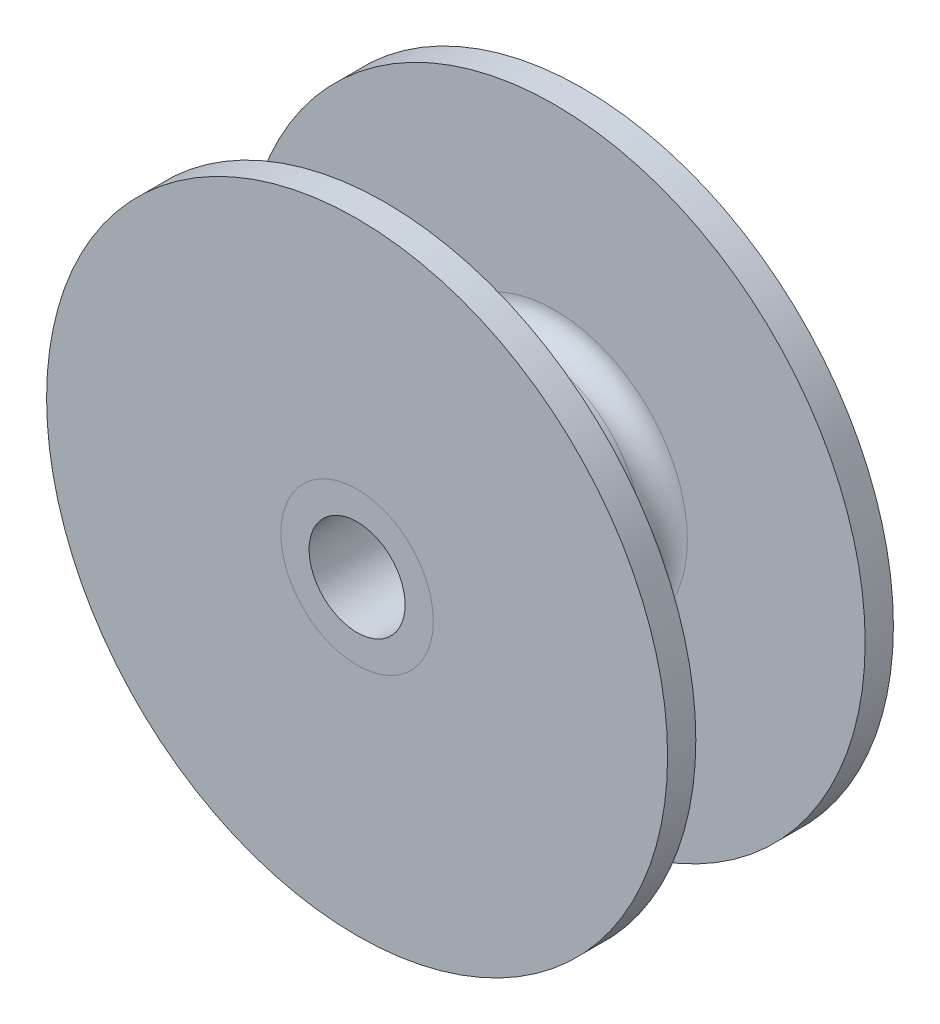
ISO-10303-21;
HEADER;
FILE_DESCRIPTION(('STEP AP214'),'2;1');
FILE_NAME('part.step','',(''),(''),'','','');
FILE_SCHEMA(('AUTOMOTIVE_DESIGN { 1 0 10303 214 1 1 1 1 }'));
ENDSEC;
DATA;
#1=APPLICATION_CONTEXT('core data for automotive mechanical design processes');
#2=APPLICATION_PROTOCOL_DEFINITION('international standard','automotive_design',2000,#1);
#3=PRODUCT_CONTEXT('',#1,'mechanical');
#4=PRODUCT('Part','Part','',(#3));
#5=PRODUCT_RELATED_PRODUCT_CATEGORY('part','',(#4));
#6=PRODUCT_DEFINITION_FORMATION('','',#4);
#7=PRODUCT_DEFINITION_CONTEXT('part definition',#1,'design');
#8=PRODUCT_DEFINITION('design','',#6,#7);
#9=PRODUCT_DEFINITION_SHAPE('','',#8);
#10=(LENGTH_UNIT() NAMED_UNIT(*) SI_UNIT(.MILLI.,.METRE.));
#11=(NAMED_UNIT(*) PLANE_ANGLE_UNIT() SI_UNIT($,.RADIAN.));
#12=(NAMED_UNIT(*) SI_UNIT($,.STERADIAN.) SOLID_ANGLE_UNIT());
#13=UNCERTAINTY_MEASURE_WITH_UNIT(LENGTH_MEASURE(1.E-05),#10,'distance_accuracy_value','');
#14=(GEOMETRIC_REPRESENTATION_CONTEXT(3) GLOBAL_UNCERTAINTY_ASSIGNED_CONTEXT((#13)) GLOBAL_UNIT_ASSIGNED_CONTEXT((#10,
#11,#12)) REPRESENTATION_CONTEXT('',''));
#15=CARTESIAN_POINT('',(0.,0.,0.));
#16=DIRECTION('',(0.,0.,1.));
#17=DIRECTION('',(1.,0.,0.));
#18=AXIS2_PLACEMENT_3D('',#15,#16,#17);
#19=CARTESIAN_POINT('',(0.,0.,-55.));
#20=DIRECTION('',(0.,0.,-1.));
#21=DIRECTION('',(1.,0.,0.));
#22=AXIS2_PLACEMENT_3D('',#19,#20,#21);
#23=CYLINDRICAL_SURFACE('',#22,27.);
#24=CARTESIAN_POINT('',(0.,0.,-55.));
#25=DIRECTION('',(0.,0.,1.));
#26=DIRECTION('',(1.,0.,0.));
#27=AXIS2_PLACEMENT_3D('',#24,#25,#26);
#28=CIRCLE('',#27,27.);
#29=CARTESIAN_POINT('',(27.,0.,-55.));
#30=VERTEX_POINT('',#29);
#31=EDGE_CURVE('E11',#30,#30,#28,.T.);
#32=ORIENTED_EDGE('',*,*,#31,.F.);
#33=EDGE_LOOP('',(#32));
#34=FACE_BOUND('',#33,.T.);
#35=CARTESIAN_POINT('',(0.,0.,-80.));
#36=DIRECTION('',(0.,0.,1.));
#37=DIRECTION('',(1.,0.,0.));
#38=AXIS2_PLACEMENT_3D('',#35,#36,#37);
#39=CIRCLE('',#38,27.);
#40=CARTESIAN_POINT('',(27.,0.,-80.));
#41=VERTEX_POINT('',#40);
#42=EDGE_CURVE('E46',#41,#41,#39,.T.);
#43=ORIENTED_EDGE('',*,*,#42,.T.);
#44=EDGE_LOOP('',(#43));
#45=FACE_BOUND('',#44,.T.);
#46=ADVANCED_FACE('F43',(#34,#45),#23,.T.);
#47=CARTESIAN_POINT('',(0.,0.,-55.));
#48=DIRECTION('',(0.,0.,-1.));
#49=DIRECTION('',(1.,0.,0.));
#50=AXIS2_PLACEMENT_3D('',#47,#48,#49);
#51=PLANE('',#50);
#52=CARTESIAN_POINT('',(0.,0.,-55.));
#53=DIRECTION('',(0.,0.,1.));
#54=DIRECTION('',(1.,0.,0.));
#55=AXIS2_PLACEMENT_3D('',#52,#53,#54);
#56=CIRCLE('',#55,17.);
#57=CARTESIAN_POINT('',(17.,0.,-55.));
#58=VERTEX_POINT('',#57);
#59=EDGE_CURVE('E53',#58,#58,#56,.T.);
#60=ORIENTED_EDGE('',*,*,#59,.F.);
#61=EDGE_LOOP('',(#60));
#62=FACE_BOUND('',#61,.T.);
#63=ORIENTED_EDGE('',*,*,#31,.T.);
#64=EDGE_LOOP('',(#63));
#65=FACE_BOUND('',#64,.T.);
#66=ADVANCED_FACE('F64',(#62,#65),#51,.F.);
#67=CARTESIAN_POINT('',(0.,0.,-80.));
#68=DIRECTION('',(0.,0.,-1.));
#69=DIRECTION('',(1.,0.,0.));
#70=AXIS2_PLACEMENT_3D('',#67,#68,#69);
#71=PLANE('',#70);
#72=CARTESIAN_POINT('',(0.,0.,-80.));
#73=DIRECTION('',(0.,0.,1.));
#74=DIRECTION('',(1.,0.,0.));
#75=AXIS2_PLACEMENT_3D('',#72,#73,#74);
#76=CIRCLE('',#75,17.);
#77=CARTESIAN_POINT('',(17.,0.,-80.));
#78=VERTEX_POINT('',#77);
#79=EDGE_CURVE('E55',#78,#78,#76,.T.);
#80=ORIENTED_EDGE('',*,*,#79,.T.);
#81=EDGE_LOOP('',(#80));
#82=FACE_BOUND('',#81,.T.);
#83=ORIENTED_EDGE('',*,*,#42,.F.);
#84=EDGE_LOOP('',(#83));
#85=FACE_BOUND('',#84,.T.);
#86=ADVANCED_FACE('F66',(#82,#85),#71,.T.);
#87=CARTESIAN_POINT('',(0.,0.,-55.));
#88=DIRECTION('',(0.,0.,-1.));
#89=DIRECTION('',(1.,0.,0.));
#90=AXIS2_PLACEMENT_3D('',#87,#88,#89);
#91=CYLINDRICAL_SURFACE('',#90,17.);
#92=ORIENTED_EDGE('',*,*,#59,.T.);
#93=EDGE_LOOP('',(#92));
#94=FACE_BOUND('',#93,.T.);
#95=ORIENTED_EDGE('',*,*,#79,.F.);
#96=EDGE_LOOP('',(#95));
#97=FACE_BOUND('',#96,.T.);
#98=ADVANCED_FACE('F61',(#94,#97),#91,.F.);
#99=CLOSED_SHELL('',(#46,#66,#86,#98));
#100=MANIFOLD_SOLID_BREP('B2',#99);
#101=CARTESIAN_POINT('',(0.,0.,-25.));
#102=DIRECTION('',(0.,0.,1.));
#103=DIRECTION('',(1.,0.,0.));
#104=AXIS2_PLACEMENT_3D('',#101,#102,#103);
#105=CYLINDRICAL_SURFACE('',#104,27.);
#106=CARTESIAN_POINT('',(0.,0.,-25.));
#107=DIRECTION('',(0.,0.,1.));
#108=DIRECTION('',(1.,0.,0.));
#109=AXIS2_PLACEMENT_3D('',#106,#107,#108);
#110=CIRCLE('',#109,27.);
#111=CARTESIAN_POINT('',(27.,0.,-25.));
#112=VERTEX_POINT('',#111);
#113=EDGE_CURVE('E42',#112,#112,#110,.T.);
#114=ORIENTED_EDGE('',*,*,#113,.T.);
#115=EDGE_LOOP('',(#114));
#116=FACE_BOUND('',#115,.T.);
#117=CARTESIAN_POINT('',(0.,0.,0.));
#118=DIRECTION('',(0.,0.,1.));
#119=DIRECTION('',(1.,0.,0.));
#120=AXIS2_PLACEMENT_3D('',#117,#118,#119);
#121=CIRCLE('',#120,27.);
#122=CARTESIAN_POINT('',(27.,0.,0.));
#123=VERTEX_POINT('',#122);
#124=EDGE_CURVE('E114',#123,#123,#121,.T.);
#125=ORIENTED_EDGE('',*,*,#124,.F.);
#126=EDGE_LOOP('',(#125));
#127=FACE_BOUND('',#126,.T.);
#128=ADVANCED_FACE('F111',(#116,#127),#105,.T.);
#129=CARTESIAN_POINT('',(0.,0.,-25.));
#130=DIRECTION('',(0.,0.,1.));
#131=DIRECTION('',(1.,0.,0.));
#132=AXIS2_PLACEMENT_3D('',#129,#130,#131);
#133=PLANE('',#132);
#134=CARTESIAN_POINT('',(0.,0.,-25.));
#135=DIRECTION('',(0.,0.,1.));
#136=DIRECTION('',(1.,0.,0.));
#137=AXIS2_PLACEMENT_3D('',#134,#135,#136);
#138=CIRCLE('',#137,17.);
#139=CARTESIAN_POINT('',(17.,0.,-25.));
#140=VERTEX_POINT('',#139);
#141=EDGE_CURVE('E121',#140,#140,#138,.T.);
#142=ORIENTED_EDGE('',*,*,#141,.T.);
#143=EDGE_LOOP('',(#142));
#144=FACE_BOUND('',#143,.T.);
#145=ORIENTED_EDGE('',*,*,#113,.F.);
#146=EDGE_LOOP('',(#145));
#147=FACE_BOUND('',#146,.T.);
#148=ADVANCED_FACE('F129',(#144,#147),#133,.F.);
#149=CARTESIAN_POINT('',(0.,0.,0.));
#150=DIRECTION('',(0.,0.,1.));
#151=DIRECTION('',(1.,0.,0.));
#152=AXIS2_PLACEMENT_3D('',#149,#150,#151);
#153=PLANE('',#152);
#154=CARTESIAN_POINT('',(0.,0.,0.));
#155=DIRECTION('',(0.,0.,1.));
#156=DIRECTION('',(1.,0.,0.));
#157=AXIS2_PLACEMENT_3D('',#154,#155,#156);
#158=CIRCLE('',#157,17.);
#159=CARTESIAN_POINT('',(17.,0.,0.));
#160=VERTEX_POINT('',#159);
#161=EDGE_CURVE('E123',#160,#160,#158,.T.);
#162=ORIENTED_EDGE('',*,*,#161,.F.);
#163=EDGE_LOOP('',(#162));
#164=FACE_BOUND('',#163,.T.);
#165=ORIENTED_EDGE('',*,*,#124,.T.);
#166=EDGE_LOOP('',(#165));
#167=FACE_BOUND('',#166,.T.);
#168=ADVANCED_FACE('F135',(#164,#167),#153,.T.);
#169=CARTESIAN_POINT('',(0.,0.,-25.));
#170=DIRECTION('',(0.,0.,1.));
#171=DIRECTION('',(1.,0.,0.));
#172=AXIS2_PLACEMENT_3D('',#169,#170,#171);
#173=CYLINDRICAL_SURFACE('',#172,17.);
#174=ORIENTED_EDGE('',*,*,#141,.F.);
#175=EDGE_LOOP('',(#174));
#176=FACE_BOUND('',#175,.T.);
#177=ORIENTED_EDGE('',*,*,#161,.T.);
#178=EDGE_LOOP('',(#177));
#179=FACE_BOUND('',#178,.T.);
#180=ADVANCED_FACE('F132',(#176,#179),#173,.F.);
#181=CLOSED_SHELL('',(#128,#148,#168,#180));
#182=MANIFOLD_SOLID_BREP('B6',#181);
#183=CARTESIAN_POINT('',(0.,0.,0.));
#184=DIRECTION('',(0.,0.,1.));
#185=DIRECTION('',(1.,0.,0.));
#186=AXIS2_PLACEMENT_3D('',#183,#184,#185);
#187=CYLINDRICAL_SURFACE('',#186,110.);
#188=CARTESIAN_POINT('',(0.,0.,0.));
#189=DIRECTION('',(0.,0.,1.));
#190=DIRECTION('',(1.,0.,0.));
#191=AXIS2_PLACEMENT_3D('',#188,#189,#190);
#192=CIRCLE('',#191,110.);
#193=CARTESIAN_POINT('',(110.,0.,0.));
#194=VERTEX_POINT('',#193);
#195=EDGE_CURVE('E110',#194,#194,#192,.T.);
#196=ORIENTED_EDGE('',*,*,#195,.F.);
#197=EDGE_LOOP('',(#196));
#198=FACE_BOUND('',#197,.T.);
#199=CARTESIAN_POINT('',(0.,0.,-10.));
#200=DIRECTION('',(0.,0.,1.));
#201=DIRECTION('',(1.,0.,0.));
#202=AXIS2_PLACEMENT_3D('',#199,#200,#201);
#203=CIRCLE('',#202,110.);
#204=CARTESIAN_POINT('',(110.,0.,-10.));
#205=VERTEX_POINT('',#204);
#206=EDGE_CURVE('E227',#205,#205,#203,.T.);
#207=ORIENTED_EDGE('',*,*,#206,.T.);
#208=EDGE_LOOP('',(#207));
#209=FACE_BOUND('',#208,.T.);
#210=ADVANCED_FACE('F172',(#198,#209),#187,.T.);
#211=CARTESIAN_POINT('',(0.,0.,-80.));
#212=DIRECTION('',(0.,0.,1.));
#213=DIRECTION('',(1.,0.,0.));
#214=AXIS2_PLACEMENT_3D('',#211,#212,#213);
#215=CIRCLE('',#214,110.);
#216=CARTESIAN_POINT('',(110.,0.,-80.));
#217=VERTEX_POINT('',#216);
#218=EDGE_CURVE('E185',#217,#217,#215,.T.);
#219=ORIENTED_EDGE('',*,*,#218,.T.);
#220=EDGE_LOOP('',(#219));
#221=FACE_BOUND('',#220,.T.);
#222=CARTESIAN_POINT('',(0.,0.,-70.0000000000001));
#223=DIRECTION('',(0.,0.,1.));
#224=DIRECTION('',(1.,0.,0.));
#225=AXIS2_PLACEMENT_3D('',#222,#223,#224);
#226=CIRCLE('',#225,110.);
#227=CARTESIAN_POINT('',(110.,0.,-70.0000000000001));
#228=VERTEX_POINT('',#227);
#229=EDGE_CURVE('E272',#228,#228,#226,.T.);
#230=ORIENTED_EDGE('',*,*,#229,.F.);
#231=EDGE_LOOP('',(#230));
#232=FACE_BOUND('',#231,.T.);
#233=ADVANCED_FACE('F213',(#221,#232),#187,.T.);
#234=CARTESIAN_POINT('',(0.,-110.,-39.999999999996));
#235=DIRECTION('',(0.,1.,0.));
#236=DIRECTION('',(0.,0.,1.));
#237=AXIS2_PLACEMENT_3D('',#234,#235,#236);
#238=CYLINDRICAL_SURFACE('',#237,2.);
#239=CARTESIAN_POINT('',(0.,27.,-37.999999999996));
#240=CARTESIAN_POINT('',(0.112175887501454,26.9999990225906,-38.0000049175873));
#241=CARTESIAN_POINT('',(0.224429186264771,26.9992934566446,-38.009469302324));
#242=CARTESIAN_POINT('',(0.445832961119939,26.9965466491973,-38.0470869360647));
#243=CARTESIAN_POINT('',(0.554979725670173,26.9945038746501,-38.0752616360889));
#244=CARTESIAN_POINT('',(0.766931563692383,26.9893136130415,-38.1494833324411));
#245=CARTESIAN_POINT('',(0.869740073504474,26.9861667308854,-38.1955205439258));
#246=CARTESIAN_POINT('',(1.06614462843443,26.9791216535465,-38.3041436978295));
#247=CARTESIAN_POINT('',(1.15974270449925,26.9752236245585,-38.3667259807059));
#248=CARTESIAN_POINT('',(1.33528660407323,26.9671051055233,-38.5068017600227));
#249=CARTESIAN_POINT('',(1.41721103295865,26.9628840446584,-38.5843220375619));
#250=CARTESIAN_POINT('',(1.56689876933723,26.9546000277983,-38.7520171942602));
#251=CARTESIAN_POINT('',(1.63466146957543,26.950537078589,-38.842192615795));
#252=CARTESIAN_POINT('',(1.75417218843521,26.9430228935871,-39.0327646895706));
#253=CARTESIAN_POINT('',(1.80590179600872,26.9395723629723,-39.1331729178552));
#254=CARTESIAN_POINT('',(1.89176024390719,26.9336797706558,-39.3412794956697));
#255=CARTESIAN_POINT('',(1.92588933657936,26.9312376944955,-39.448977740654));
#256=CARTESIAN_POINT('',(1.97551690390294,26.9276429968481,-39.6683958433428));
#257=CARTESIAN_POINT('',(1.99104974374181,26.9264879971657,-39.7801078887996));
#258=CARTESIAN_POINT('',(2.00315001375743,26.9255905914973,-40.0045591197535));
#259=CARTESIAN_POINT('',(1.9997177320856,26.9258481640491,-40.1172982896187));
#260=CARTESIAN_POINT('',(1.97401363880864,26.9277446502495,-40.3403686635335));
#261=CARTESIAN_POINT('',(1.95177909637425,26.9293808312464,-40.4507041885285));
#262=CARTESIAN_POINT('',(1.88915949593911,26.9338458707277,-40.6660727498364));
#263=CARTESIAN_POINT('',(1.84877429341196,26.936674738709,-40.77110574392));
#264=CARTESIAN_POINT('',(1.7509577521393,26.943209533427,-40.9730069854656));
#265=CARTESIAN_POINT('',(1.69350960347258,26.946916324335,-41.069867059801));
#266=CARTESIAN_POINT('',(1.56321005645035,26.9547884452537,-41.2525835977259));
#267=CARTESIAN_POINT('',(1.49035841263603,26.9589537825709,-41.338439885932));
#268=CARTESIAN_POINT('',(1.33111041524629,26.967285782383,-41.4969284720028));
#269=CARTESIAN_POINT('',(1.2446818257522,26.9714524238557,-41.569528384542));
#270=CARTESIAN_POINT('',(1.06084604870782,26.9793079157915,-41.6991932646712));
#271=CARTESIAN_POINT('',(0.963438855680241,26.9829967660162,-41.7562582245106));
#272=CARTESIAN_POINT('',(0.760390525216006,26.9894815193447,-41.8532309728045));
#273=CARTESIAN_POINT('',(0.654748747984288,26.9922773529783,-41.8931374265373));
#274=CARTESIAN_POINT('',(0.438239263508097,26.9966601917496,-41.9546381914903));
#275=CARTESIAN_POINT('',(0.32737164198596,26.9982472167086,-41.9762328029792));
#276=CARTESIAN_POINT('',(0.103838433277556,27.0000310702357,-42.0004565161867));
#277=CARTESIAN_POINT('',(-0.00882227907535201,27.0002311792522,-42.003130371158));
#278=CARTESIAN_POINT('',(-0.232990480027274,26.9992273975668,-41.9895537622883));
#279=CARTESIAN_POINT('',(-0.344497977090753,26.9980235171773,-41.973303437448));
#280=CARTESIAN_POINT('',(-0.563067590666639,26.9943493213913,-41.9223768311556));
#281=CARTESIAN_POINT('',(-0.670134542789261,26.9918804249015,-41.8877211924578));
#282=CARTESIAN_POINT('',(-0.876933362945404,26.9859537378184,-41.8009887304011));
#283=CARTESIAN_POINT('',(-0.976665138750343,26.9824959347938,-41.7489116880404));
#284=CARTESIAN_POINT('',(-1.1661668679239,26.9749713062901,-41.6287015276606));
#285=CARTESIAN_POINT('',(-1.25591789507196,26.9709033569804,-41.5605386453793));
#286=CARTESIAN_POINT('',(-1.42271962776009,26.9626196229757,-41.4101348508566));
#287=CARTESIAN_POINT('',(-1.49977015872926,26.9584038362496,-41.3278937451388));
#288=CARTESIAN_POINT('',(-1.63913631724607,26.9502899543756,-41.1514743562159));
#289=CARTESIAN_POINT('',(-1.70142282193802,26.9463924969084,-41.0572730334468));
#290=CARTESIAN_POINT('',(-1.80929339188762,26.9393650989572,-40.8597224454099));
#291=CARTESIAN_POINT('',(-1.85487759361663,26.9362351522021,-40.756373254896));
#292=CARTESIAN_POINT('',(-1.92799958288999,26.9311004070177,-40.5435653130893));
#293=CARTESIAN_POINT('',(-1.955555438327,26.929094482391,-40.4341127982991));
#294=CARTESIAN_POINT('',(-1.99189744024598,26.9264309146656,-40.2121191812945));
#295=CARTESIAN_POINT('',(-2.0006838632986,26.9257732517001,-40.0995781246149));
#296=CARTESIAN_POINT('',(-1.99923466996863,26.9258808708066,-39.874891514981));
#297=CARTESIAN_POINT('',(-1.98904482224961,26.9266427291527,-39.7627456623313));
#298=CARTESIAN_POINT('',(-1.9500275182312,26.929496281311,-39.5417623560675));
#299=CARTESIAN_POINT('',(-1.92120003068028,26.9315879773531,-39.4329249080012));
#300=CARTESIAN_POINT('',(-1.84573678027877,26.9368646369818,-39.2216431679479));
#301=CARTESIAN_POINT('',(-1.7991015613442,26.9400495671767,-39.1191986808066));
#302=CARTESIAN_POINT('',(-1.68935218293158,26.9471538348833,-38.9235863401785));
#303=CARTESIAN_POINT('',(-1.62623836244982,26.9510731572866,-38.8304182959121));
#304=CARTESIAN_POINT('',(-1.48515209570016,26.9592157436166,-38.65576995994));
#305=CARTESIAN_POINT('',(-1.40714602099835,26.9634396817038,-38.5743168661932));
#306=CARTESIAN_POINT('',(-1.23854523729396,26.9717095046905,-38.4256301733302));
#307=CARTESIAN_POINT('',(-1.14794747099011,26.9757553460325,-38.3584000376207));
#308=CARTESIAN_POINT('',(-0.956595096585333,26.9832188898059,-38.2399973065401));
#309=CARTESIAN_POINT('',(-0.85582488063199,26.9866356035551,-38.1888498976209));
#310=CARTESIAN_POINT('',(-0.64717259594341,26.9924436651086,-38.1042648014553));
#311=CARTESIAN_POINT('',(-0.539298940599423,26.9948362016242,-38.0708065725975));
#312=CARTESIAN_POINT('',(-0.358981153079348,26.9977059855291,-38.0311548745569));
#313=CARTESIAN_POINT('',(-0.287699624846746,26.9985623695273,-38.0194871218935));
#314=CARTESIAN_POINT('',(-0.144289407827501,26.999709690566,-38.0039081107562));
#315=CARTESIAN_POINT('',(-0.0721607207541489,27.0000006287498,-37.9999968365984));
#316=CARTESIAN_POINT('',(0.,27.,-37.999999999996));
#317=B_SPLINE_CURVE_WITH_KNOTS('',3,(#239,#240,#241,#242,#243,#244,#245,#246,#247,#248,#249,
#250,#251,#252,#253,#254,#255,#256,#257,#258,#259,#260,#261,#262,#263,#264,#265,#266,#267,#268,
#269,#270,#271,#272,#273,#274,#275,#276,#277,#278,#279,#280,#281,#282,#283,#284,#285,#286,#287,
#288,#289,#290,#291,#292,#293,#294,#295,#296,#297,#298,#299,#300,#301,#302,#303,#304,#305,#306,
#307,#308,#309,#310,#311,#312,#313,#314,#315,#316),.UNSPECIFIED.,.T.,.F.,(4,2,2,2,2,2,2,2,2,2,2,
2,2,2,2,2,2,2,2,2,2,2,2,2,2,2,2,2,2,2,2,2,2,2,2,2,2,2,4),(0.,0.336264214509419,0.67291461664337,
1.0093808659871,1.34577275579321,1.68277344226008,2.01978857635363,2.3571892884586,
2.69458516294952,3.03135657517328,3.36812287058862,3.70422320032407,4.04032620633822,
4.37676143585567,4.71320202696238,5.05045385549587,5.38770585228748,5.72498407841206,
6.0622567739044,6.39873145104656,6.73520365674853,7.07129928151034,7.4073991314366,
7.744125824891,8.08085714633624,8.41824726191971,8.7556346206908,9.09268333195239,
9.42972707671182,9.76595896192431,10.1021914109308,10.4384135909378,10.7746288547574,
11.1116125090341,11.4486781273791,11.7862690102432,12.1234669988301,12.3397801271549,
12.5560928180839),.UNSPECIFIED.);
#318=CARTESIAN_POINT('',(0.,27.,-37.999999999996));
#319=VERTEX_POINT('',#318);
#320=EDGE_CURVE('E194',#319,#319,#317,.T.);
#321=ORIENTED_EDGE('',*,*,#320,.F.);
#322=EDGE_LOOP('',(#321));
#323=FACE_BOUND('',#322,.T.);
#324=CARTESIAN_POINT('',(0.,39.,-37.999999999996));
#325=CARTESIAN_POINT('',(-0.112261711887149,38.9999993143041,-38.0000049531068));
#326=CARTESIAN_POINT('',(-0.224602943335348,38.9995100904277,-38.0094837660461));
#327=CARTESIAN_POINT('',(-0.446186042143901,38.9976055115103,-38.0471620542966));
#328=CARTESIAN_POINT('',(-0.555424103869777,38.9961890665261,-38.07538356211));
#329=CARTESIAN_POINT('',(-0.767558969738583,38.9925903558255,-38.1497368641906));
#330=CARTESIAN_POINT('',(-0.870458984947681,38.9904084817159,-38.1958595012131));
#331=CARTESIAN_POINT('',(-1.06702852916843,38.9855246138639,-38.3046916661323));
#332=CARTESIAN_POINT('',(-1.160700224017,38.9828227426038,-38.3673972893021));
#333=CARTESIAN_POINT('',(-1.33628077004964,38.9771996146761,-38.5076889639236));
#334=CARTESIAN_POINT('',(-1.41817867138014,38.9742781575851,-38.5852887126054));
#335=CARTESIAN_POINT('',(-1.56779349958363,38.9685468503059,-38.7531384076271));
#336=CARTESIAN_POINT('',(-1.63550984595966,38.9657370046903,-38.8433888715493));
#337=CARTESIAN_POINT('',(-1.75486998806267,38.9605443424702,-39.0340361393217));
#338=CARTESIAN_POINT('',(-1.80650516369271,38.9581617551811,-39.1344383468147));
#339=CARTESIAN_POINT('',(-1.89218194767018,38.9540947496005,-39.3425010331619));
#340=CARTESIAN_POINT('',(-1.92622369465715,38.9524103258073,-39.4501614548125));
#341=CARTESIAN_POINT('',(-1.97571818553879,38.9499314204608,-39.6695831427086));
#342=CARTESIAN_POINT('',(-1.99118741195512,38.9491361498554,-39.7813406819694));
#343=CARTESIAN_POINT('',(-2.00314860440937,38.9485228638107,-40.0058688380259));
#344=CARTESIAN_POINT('',(-1.99964072621933,38.9487048403497,-40.1186394464985));
#345=CARTESIAN_POINT('',(-1.97376100975523,38.9500247940401,-40.3418805373299));
#346=CARTESIAN_POINT('',(-1.95140698277472,38.9511618685349,-40.4523530905792));
#347=CARTESIAN_POINT('',(-1.88849712155687,38.9542624386814,-40.667975642214));
#348=CARTESIAN_POINT('',(-1.84794120742796,38.9562259379604,-40.7731256172355));
#349=CARTESIAN_POINT('',(-1.74975847568304,38.9607590972627,-40.9751755562032));
#350=CARTESIAN_POINT('',(-1.69212354148523,38.9633290453744,-41.0720715693094));
#351=CARTESIAN_POINT('',(-1.56142472401876,38.9687851547168,-41.2548198514499));
#352=CARTESIAN_POINT('',(-1.48836072589601,38.9716713183013,-41.3406720382662));
#353=CARTESIAN_POINT('',(-1.32877730518329,38.9774385758277,-41.4989993036851));
#354=CARTESIAN_POINT('',(-1.24224245943553,38.9803196600819,-41.5714588380298));
#355=CARTESIAN_POINT('',(-1.05822794146622,38.9857488309016,-41.7008241470624));
#356=CARTESIAN_POINT('',(-0.960748266460778,38.9882969173823,-41.7577299177941));
#357=CARTESIAN_POINT('',(-0.757602056553157,38.9927730430039,-41.8543708791584));
#358=CARTESIAN_POINT('',(-0.651935261117936,38.9947010624027,-41.8941055231013));
#359=CARTESIAN_POINT('',(-0.43541835330256,38.9977194803577,-41.9552661291491));
#360=CARTESIAN_POINT('',(-0.324568281738523,38.9988098855085,-41.9766922354005));
#361=CARTESIAN_POINT('',(-0.100966386290932,39.00002933835,-42.0006083897022));
#362=CARTESIAN_POINT('',(0.0117831323316173,39.0001594775454,-42.0031199374147));
#363=CARTESIAN_POINT('',(0.236101995977007,38.9994466301987,-41.9891917942892));
#364=CARTESIAN_POINT('',(0.347671345107972,38.998603647045,-41.9727521694415));
#365=CARTESIAN_POINT('',(0.566402549815871,38.9960402005327,-41.9214061372983));
#366=CARTESIAN_POINT('',(0.673566716772299,38.9943202038573,-41.8865095510957));
#367=CARTESIAN_POINT('',(0.880516772841642,38.9901963652046,-41.7992501409152));
#368=CARTESIAN_POINT('',(0.980302617256196,38.9877925190851,-41.7468872111356));
#369=CARTESIAN_POINT('',(1.16976216823248,38.9825686539288,-41.6261264900511));
#370=CARTESIAN_POINT('',(1.25942668133079,38.9797482618148,-41.5577142916435));
#371=CARTESIAN_POINT('',(1.42600587507127,38.9740101594024,-41.4068180466807));
#372=CARTESIAN_POINT('',(1.50292046989067,38.9710924484491,-41.3243339054114));
#373=CARTESIAN_POINT('',(1.6418889269724,38.9654854459469,-41.1475426829375));
#374=CARTESIAN_POINT('',(1.70392887531988,38.962796369771,-41.0532246568097));
#375=CARTESIAN_POINT('',(1.81129184879058,38.9579532626305,-40.8554982829472));
#376=CARTESIAN_POINT('',(1.85661494948835,38.9557992292472,-40.7520899763109));
#377=CARTESIAN_POINT('',(1.92923342610909,38.952270648449,-40.5391699046208));
#378=CARTESIAN_POINT('',(1.95653766172297,38.9508957180042,-40.4296611678524));
#379=CARTESIAN_POINT('',(1.99237231434811,38.9490793142211,-40.207606437536));
#380=CARTESIAN_POINT('',(2.00090284528601,38.9486378352182,-40.0950604624235));
#381=CARTESIAN_POINT('',(1.99894685924227,38.9487382588598,-39.8702645084388));
#382=CARTESIAN_POINT('',(1.98848222960186,38.9492790296987,-39.7580143379565));
#383=CARTESIAN_POINT('',(1.94887823126711,38.9512806128243,-39.5368668059661));
#384=CARTESIAN_POINT('',(1.91973882712421,38.9527414268574,-39.4279694508227));
#385=CARTESIAN_POINT('',(1.84361696257035,38.9564181963861,-39.2166143030759));
#386=CARTESIAN_POINT('',(1.79663439073069,38.9586341565975,-39.1141565506918));
#387=CARTESIAN_POINT('',(1.68616353015262,38.9635713990983,-38.9185817376045));
#388=CARTESIAN_POINT('',(1.62267574054172,38.9662926661063,-38.8254643945599));
#389=CARTESIAN_POINT('',(1.48091790322138,38.9719374040612,-38.6511041105527));
#390=CARTESIAN_POINT('',(1.40263252100209,38.9748610827542,-38.5698736440922));
#391=CARTESIAN_POINT('',(1.23351327916289,38.9805796209771,-38.4216823527556));
#392=CARTESIAN_POINT('',(1.14267633879862,38.9833744486555,-38.3547250414759));
#393=CARTESIAN_POINT('',(0.950958266805865,38.9885223740789,-38.236947779205));
#394=CARTESIAN_POINT('',(0.850067342891022,38.9908750346026,-38.1861437668577));
#395=CARTESIAN_POINT('',(0.641250980584179,38.9948670582142,-38.102256886755));
#396=CARTESIAN_POINT('',(0.533334014337332,38.9965072627278,-38.0691531039185));
#397=CARTESIAN_POINT('',(0.353956245480918,38.9984560960185,-38.0302822638205));
#398=CARTESIAN_POINT('',(0.283657090938023,38.9990325129625,-38.0189409299733));
#399=CARTESIAN_POINT('',(0.142249268257466,38.9998046820457,-38.0037982320554));
#400=CARTESIAN_POINT('',(0.0711406008489247,39.0000004345276,-37.9999968611941));
#401=CARTESIAN_POINT('',(0.,39.,-37.999999999996));
#402=B_SPLINE_CURVE_WITH_KNOTS('',3,(#324,#325,#326,#327,#328,#329,#330,#331,#332,#333,#334,
#335,#336,#337,#338,#339,#340,#341,#342,#343,#344,#345,#346,#347,#348,#349,#350,#351,#352,#353,
#354,#355,#356,#357,#358,#359,#360,#361,#362,#363,#364,#365,#366,#367,#368,#369,#370,#371,#372,
#373,#374,#375,#376,#377,#378,#379,#380,#381,#382,#383,#384,#385,#386,#387,#388,#389,#390,#391,
#392,#393,#394,#395,#396,#397,#398,#399,#400,#401),.UNSPECIFIED.,.T.,.F.,(4,2,2,2,2,2,2,2,2,2,2,
2,2,2,2,2,2,2,2,2,2,2,2,2,2,2,2,2,2,2,2,2,2,2,2,2,2,2,4),(0.,0.336525444489068,0.67344718484807,
1.01019680103769,1.34686719468748,1.68384870030846,2.02084399697866,2.35801962579588,
2.69519259756487,3.03206611732896,3.3689368718981,3.70548960995619,4.04204382522304,
4.37875824070625,4.71547516278302,5.05258047621931,5.38968587540072,5.72680200646234,
6.06391548332327,6.40064571458223,6.73737477331004,7.07392483587893,7.41047693712318,
7.74733231827685,8.08418996679273,8.42136149708883,8.75853150306062,9.09553560223884,
9.4325376563308,9.76915164330415,10.105766269242,10.4423829973373,10.7789895471286,
11.1159468485194,11.4529870025239,11.790358693198,12.1273308501904,12.3405882776863,
12.5538455131185),.UNSPECIFIED.);
#403=CARTESIAN_POINT('',(0.,39.,-37.999999999996));
#404=VERTEX_POINT('',#403);
#405=EDGE_CURVE('E201',#404,#404,#402,.T.);
#406=ORIENTED_EDGE('',*,*,#405,.F.);
#407=EDGE_LOOP('',(#406));
#408=FACE_BOUND('',#407,.T.);
#409=ADVANCED_FACE('F208',(#323,#408),#238,.F.);
#410=CARTESIAN_POINT('',(0.,-27.,-37.999999999996));
#411=CARTESIAN_POINT('',(-0.112175887501593,-26.9999990225906,-38.0000049175873));
#412=CARTESIAN_POINT('',(-0.224429186264911,-26.9992934566446,-38.009469302324));
#413=CARTESIAN_POINT('',(-0.445832961120079,-26.9965466491973,-38.0470869360647));
#414=CARTESIAN_POINT('',(-0.554979725670313,-26.9945038746501,-38.0752616360889));
#415=CARTESIAN_POINT('',(-0.766931563692523,-26.9893136130415,-38.1494833324411));
#416=CARTESIAN_POINT('',(-0.869740073504614,-26.9861667308854,-38.1955205439258));
#417=CARTESIAN_POINT('',(-1.06614462843457,-26.9791216535464,-38.3041436978295));
#418=CARTESIAN_POINT('',(-1.15974270449939,-26.9752236245585,-38.3667259807059));
#419=CARTESIAN_POINT('',(-1.33528660407337,-26.9671051055233,-38.5068017600227));
#420=CARTESIAN_POINT('',(-1.41721103295879,-26.9628840446584,-38.5843220375619));
#421=CARTESIAN_POINT('',(-1.56689876933737,-26.9546000277983,-38.7520171942602));
#422=CARTESIAN_POINT('',(-1.63466146957557,-26.950537078589,-38.842192615795));
#423=CARTESIAN_POINT('',(-1.75417218843535,-26.9430228935871,-39.0327646895706));
#424=CARTESIAN_POINT('',(-1.80590179600886,-26.9395723629723,-39.1331729178552));
#425=CARTESIAN_POINT('',(-1.89176024390732,-26.9336797706558,-39.3412794956697));
#426=CARTESIAN_POINT('',(-1.9258893365795,-26.9312376944955,-39.448977740654));
#427=CARTESIAN_POINT('',(-1.97551690390308,-26.9276429968481,-39.6683958433428));
#428=CARTESIAN_POINT('',(-1.99104974374195,-26.9264879971657,-39.7801078887996));
#429=CARTESIAN_POINT('',(-2.00315001375757,-26.9255905914973,-40.0045591197535));
#430=CARTESIAN_POINT('',(-1.99971773208574,-26.9258481640491,-40.1172982896187));
#431=CARTESIAN_POINT('',(-1.97401363880878,-26.9277446502495,-40.3403686635336));
#432=CARTESIAN_POINT('',(-1.95177909637439,-26.9293808312464,-40.4507041885285));
#433=CARTESIAN_POINT('',(-1.88915949593924,-26.9338458707277,-40.6660727498364));
#434=CARTESIAN_POINT('',(-1.8487742934121,-26.9366747387089,-40.77110574392));
#435=CARTESIAN_POINT('',(-1.75095775213944,-26.943209533427,-40.9730069854656));
#436=CARTESIAN_POINT('',(-1.69350960347272,-26.946916324335,-41.069867059801));
#437=CARTESIAN_POINT('',(-1.56321005645049,-26.9547884452537,-41.2525835977259));
#438=CARTESIAN_POINT('',(-1.49035841263616,-26.9589537825709,-41.338439885932));
#439=CARTESIAN_POINT('',(-1.33111041524643,-26.967285782383,-41.4969284720028));
#440=CARTESIAN_POINT('',(-1.24468182575233,-26.9714524238557,-41.569528384542));
#441=CARTESIAN_POINT('',(-1.06084604870796,-26.9793079157915,-41.6991932646712));
#442=CARTESIAN_POINT('',(-0.96343885568038,-26.9829967660162,-41.7562582245106));
#443=CARTESIAN_POINT('',(-0.760390525216146,-26.9894815193447,-41.8532309728045));
#444=CARTESIAN_POINT('',(-0.654748747984428,-26.9922773529783,-41.8931374265373));
#445=CARTESIAN_POINT('',(-0.438239263508236,-26.9966601917496,-41.9546381914903));
#446=CARTESIAN_POINT('',(-0.3273716419861,-26.9982472167086,-41.9762328029792));
#447=CARTESIAN_POINT('',(-0.103838433277696,-27.0000310702357,-42.0004565161867));
#448=CARTESIAN_POINT('',(0.00882227907521224,-27.0002311792522,-42.003130371158));
#449=CARTESIAN_POINT('',(0.232990480027134,-26.9992273975668,-41.9895537622883));
#450=CARTESIAN_POINT('',(0.344497977090614,-26.9980235171773,-41.973303437448));
#451=CARTESIAN_POINT('',(0.563067590666499,-26.9943493213913,-41.9223768311556));
#452=CARTESIAN_POINT('',(0.67013454278912,-26.9918804249015,-41.8877211924578));
#453=CARTESIAN_POINT('',(0.876933362945264,-26.9859537378184,-41.8009887304011));
#454=CARTESIAN_POINT('',(0.976665138750202,-26.9824959347938,-41.7489116880404));
#455=CARTESIAN_POINT('',(1.16616686792376,-26.9749713062901,-41.6287015276606));
#456=CARTESIAN_POINT('',(1.25591789507182,-26.9709033569804,-41.5605386453793));
#457=CARTESIAN_POINT('',(1.42271962775995,-26.9626196229757,-41.4101348508566));
#458=CARTESIAN_POINT('',(1.49977015872912,-26.9584038362496,-41.3278937451389));
#459=CARTESIAN_POINT('',(1.63913631724594,-26.9502899543756,-41.1514743562159));
#460=CARTESIAN_POINT('',(1.70142282193789,-26.9463924969084,-41.0572730334468));
#461=CARTESIAN_POINT('',(1.80929339188748,-26.9393650989572,-40.8597224454099));
#462=CARTESIAN_POINT('',(1.85487759361649,-26.9362351522021,-40.756373254896));
#463=CARTESIAN_POINT('',(1.92799958288985,-26.9311004070177,-40.5435653130893));
#464=CARTESIAN_POINT('',(1.95555543832686,-26.929094482391,-40.4341127982991));
#465=CARTESIAN_POINT('',(1.99189744024584,-26.9264309146656,-40.2121191812945));
#466=CARTESIAN_POINT('',(2.00068386329846,-26.9257732517001,-40.0995781246149));
#467=CARTESIAN_POINT('',(1.99923466996849,-26.9258808708066,-39.874891514981));
#468=CARTESIAN_POINT('',(1.98904482224947,-26.9266427291527,-39.7627456623313));
#469=CARTESIAN_POINT('',(1.95002751823106,-26.929496281311,-39.5417623560675));
#470=CARTESIAN_POINT('',(1.92120003068014,-26.9315879773531,-39.4329249080012));
#471=CARTESIAN_POINT('',(1.84573678027863,-26.9368646369818,-39.2216431679479));
#472=CARTESIAN_POINT('',(1.79910156134406,-26.9400495671767,-39.1191986808066));
#473=CARTESIAN_POINT('',(1.68935218293144,-26.9471538348833,-38.9235863401785));
#474=CARTESIAN_POINT('',(1.62623836244968,-26.9510731572867,-38.8304182959121));
#475=CARTESIAN_POINT('',(1.48515209570002,-26.9592157436166,-38.65576995994));
#476=CARTESIAN_POINT('',(1.40714602099821,-26.9634396817038,-38.5743168661932));
#477=CARTESIAN_POINT('',(1.23854523729382,-26.9717095046905,-38.4256301733302));
#478=CARTESIAN_POINT('',(1.14794747098997,-26.9757553460325,-38.3584000376207));
#479=CARTESIAN_POINT('',(0.956595096585194,-26.9832188898059,-38.2399973065401));
#480=CARTESIAN_POINT('',(0.855824880631851,-26.9866356035551,-38.1888498976209));
#481=CARTESIAN_POINT('',(0.64717259594327,-26.9924436651087,-38.1042648014553));
#482=CARTESIAN_POINT('',(0.539298940599282,-26.9948362016243,-38.0708065725975));
#483=CARTESIAN_POINT('',(0.358981153079206,-26.9977059855291,-38.0311548745569));
#484=CARTESIAN_POINT('',(0.287699624846605,-26.9985623695273,-38.0194871218935));
#485=CARTESIAN_POINT('',(0.144289407827361,-26.999709690566,-38.0039081107562));
#486=CARTESIAN_POINT('',(0.0721607207540092,-27.0000006287498,-37.9999968365984));
#487=CARTESIAN_POINT('',(0.,-27.,-37.999999999996));
#488=B_SPLINE_CURVE_WITH_KNOTS('',3,(#410,#411,#412,#413,#414,#415,#416,#417,#418,#419,#420,
#421,#422,#423,#424,#425,#426,#427,#428,#429,#430,#431,#432,#433,#434,#435,#436,#437,#438,#439,
#440,#441,#442,#443,#444,#445,#446,#447,#448,#449,#450,#451,#452,#453,#454,#455,#456,#457,#458,
#459,#460,#461,#462,#463,#464,#465,#466,#467,#468,#469,#470,#471,#472,#473,#474,#475,#476,#477,
#478,#479,#480,#481,#482,#483,#484,#485,#486,#487),.UNSPECIFIED.,.T.,.F.,(4,2,2,2,2,2,2,2,2,2,2,
2,2,2,2,2,2,2,2,2,2,2,2,2,2,2,2,2,2,2,2,2,2,2,2,2,2,2,4),(0.,0.336264214509419,0.67291461664337,
1.0093808659871,1.34577275579321,1.68277344226008,2.01978857635363,2.3571892884586,
2.69458516294952,3.03135657517328,3.36812287058863,3.70422320032408,4.04032620633822,
4.37676143585568,4.71320202696239,5.05045385549587,5.38770585228748,5.72498407841206,
6.0622567739044,6.39873145104656,6.73520365674853,7.07129928151033,7.4073991314366,
7.744125824891,8.08085714633624,8.41824726191973,8.7556346206908,9.09268333195239,
9.42972707671182,9.76595896192431,10.1021914109308,10.4384135909378,10.7746288547574,
11.1116125090341,11.4486781273791,11.7862690102432,12.1234669988302,12.3397801271549,
12.5560928180839),.UNSPECIFIED.);
#489=CARTESIAN_POINT('',(0.,-27.,-37.999999999996));
#490=VERTEX_POINT('',#489);
#491=EDGE_CURVE('E200',#490,#490,#488,.T.);
#492=ORIENTED_EDGE('',*,*,#491,.F.);
#493=EDGE_LOOP('',(#492));
#494=FACE_BOUND('',#493,.T.);
#495=CARTESIAN_POINT('',(0.,-39.,-37.999999999996));
#496=CARTESIAN_POINT('',(0.112261711887009,-38.9999993143041,-38.0000049531068));
#497=CARTESIAN_POINT('',(0.224602943335208,-38.9995100904277,-38.0094837660461));
#498=CARTESIAN_POINT('',(0.446186042143761,-38.9976055115103,-38.0471620542966));
#499=CARTESIAN_POINT('',(0.555424103869637,-38.9961890665261,-38.07538356211));
#500=CARTESIAN_POINT('',(0.767558969738443,-38.9925903558255,-38.1497368641906));
#501=CARTESIAN_POINT('',(0.870458984947542,-38.9904084817159,-38.1958595012131));
#502=CARTESIAN_POINT('',(1.06702852916829,-38.9855246138639,-38.3046916661323));
#503=CARTESIAN_POINT('',(1.16070022401686,-38.9828227426038,-38.3673972893021));
#504=CARTESIAN_POINT('',(1.3362807700495,-38.9771996146761,-38.5076889639236));
#505=CARTESIAN_POINT('',(1.41817867138,-38.9742781575851,-38.5852887126054));
#506=CARTESIAN_POINT('',(1.56779349958349,-38.9685468503059,-38.7531384076271));
#507=CARTESIAN_POINT('',(1.63550984595953,-38.9657370046903,-38.8433888715493));
#508=CARTESIAN_POINT('',(1.75486998806253,-38.9605443424702,-39.0340361393217));
#509=CARTESIAN_POINT('',(1.80650516369258,-38.9581617551811,-39.1344383468147));
#510=CARTESIAN_POINT('',(1.89218194767004,-38.9540947496005,-39.3425010331619));
#511=CARTESIAN_POINT('',(1.92622369465701,-38.9524103258073,-39.4501614548125));
#512=CARTESIAN_POINT('',(1.97571818553865,-38.9499314204608,-39.6695831427086));
#513=CARTESIAN_POINT('',(1.99118741195498,-38.9491361498554,-39.7813406819694));
#514=CARTESIAN_POINT('',(2.00314860440923,-38.9485228638107,-40.0058688380259));
#515=CARTESIAN_POINT('',(1.99964072621919,-38.9487048403497,-40.1186394464985));
#516=CARTESIAN_POINT('',(1.97376100975509,-38.9500247940401,-40.3418805373299));
#517=CARTESIAN_POINT('',(1.95140698277458,-38.9511618685349,-40.4523530905792));
#518=CARTESIAN_POINT('',(1.88849712155672,-38.9542624386814,-40.667975642214));
#519=CARTESIAN_POINT('',(1.84794120742781,-38.9562259379604,-40.7731256172355));
#520=CARTESIAN_POINT('',(1.7497584756829,-38.9607590972627,-40.9751755562032));
#521=CARTESIAN_POINT('',(1.69212354148508,-38.9633290453744,-41.0720715693094));
#522=CARTESIAN_POINT('',(1.56142472401861,-38.9687851547168,-41.2548198514499));
#523=CARTESIAN_POINT('',(1.48836072589586,-38.9716713183013,-41.3406720382662));
#524=CARTESIAN_POINT('',(1.32877730518315,-38.9774385758277,-41.4989993036851));
#525=CARTESIAN_POINT('',(1.24224245943539,-38.9803196600819,-41.5714588380298));
#526=CARTESIAN_POINT('',(1.05822794146608,-38.9857488309016,-41.7008241470624));
#527=CARTESIAN_POINT('',(0.960748266460639,-38.9882969173823,-41.7577299177941));
#528=CARTESIAN_POINT('',(0.757602056553017,-38.9927730430039,-41.8543708791584));
#529=CARTESIAN_POINT('',(0.651935261117796,-38.9947010624027,-41.8941055231013));
#530=CARTESIAN_POINT('',(0.43541835330242,-38.9977194803577,-41.9552661291491));
#531=CARTESIAN_POINT('',(0.324568281738383,-38.9988098855085,-41.9766922354005));
#532=CARTESIAN_POINT('',(0.100966386290792,-39.00002933835,-42.0006083897022));
#533=CARTESIAN_POINT('',(-0.011783132331757,-39.0001594775454,-42.0031199374147));
#534=CARTESIAN_POINT('',(-0.236101995977146,-38.9994466301987,-41.9891917942892));
#535=CARTESIAN_POINT('',(-0.347671345108112,-38.998603647045,-41.9727521694415));
#536=CARTESIAN_POINT('',(-0.566402549816012,-38.9960402005327,-41.9214061372983));
#537=CARTESIAN_POINT('',(-0.67356671677244,-38.9943202038572,-41.8865095510957));
#538=CARTESIAN_POINT('',(-0.880516772841785,-38.9901963652046,-41.7992501409152));
#539=CARTESIAN_POINT('',(-0.98030261725634,-38.9877925190851,-41.7468872111356));
#540=CARTESIAN_POINT('',(-1.16976216823262,-38.9825686539288,-41.6261264900511));
#541=CARTESIAN_POINT('',(-1.25942668133093,-38.9797482618148,-41.5577142916435));
#542=CARTESIAN_POINT('',(-1.42600587507141,-38.9740101594024,-41.4068180466807));
#543=CARTESIAN_POINT('',(-1.50292046989081,-38.9710924484491,-41.3243339054114));
#544=CARTESIAN_POINT('',(-1.64188892697254,-38.9654854459469,-41.1475426829375));
#545=CARTESIAN_POINT('',(-1.70392887532002,-38.962796369771,-41.0532246568097));
#546=CARTESIAN_POINT('',(-1.81129184879072,-38.9579532626305,-40.8554982829472));
#547=CARTESIAN_POINT('',(-1.85661494948849,-38.9557992292472,-40.7520899763109));
#548=CARTESIAN_POINT('',(-1.92923342610923,-38.952270648449,-40.5391699046207));
#549=CARTESIAN_POINT('',(-1.95653766172311,-38.9508957180042,-40.4296611678524));
#550=CARTESIAN_POINT('',(-1.99237231434825,-38.9490793142211,-40.2076064375361));
#551=CARTESIAN_POINT('',(-2.00090284528615,-38.9486378352182,-40.0950604624235));
#552=CARTESIAN_POINT('',(-1.99894685924241,-38.9487382588598,-39.8702645084388));
#553=CARTESIAN_POINT('',(-1.988482229602,-38.9492790296987,-39.7580143379565));
#554=CARTESIAN_POINT('',(-1.94887823126725,-38.9512806128243,-39.5368668059661));
#555=CARTESIAN_POINT('',(-1.91973882712435,-38.9527414268574,-39.4279694508227));
#556=CARTESIAN_POINT('',(-1.84361696257049,-38.9564181963861,-39.2166143030759));
#557=CARTESIAN_POINT('',(-1.79663439073083,-38.9586341565975,-39.1141565506918));
#558=CARTESIAN_POINT('',(-1.68616353015276,-38.9635713990983,-38.9185817376045));
#559=CARTESIAN_POINT('',(-1.62267574054186,-38.9662926661063,-38.8254643945599));
#560=CARTESIAN_POINT('',(-1.48091790322152,-38.9719374040611,-38.6511041105527));
#561=CARTESIAN_POINT('',(-1.40263252100222,-38.9748610827542,-38.5698736440922));
#562=CARTESIAN_POINT('',(-1.23351327916303,-38.9805796209771,-38.4216823527556));
#563=CARTESIAN_POINT('',(-1.14267633879876,-38.9833744486555,-38.3547250414759));
#564=CARTESIAN_POINT('',(-0.950958266806007,-38.9885223740789,-38.236947779205));
#565=CARTESIAN_POINT('',(-0.850067342891165,-38.9908750346026,-38.1861437668577));
#566=CARTESIAN_POINT('',(-0.641250980584322,-38.9948670582142,-38.102256886755));
#567=CARTESIAN_POINT('',(-0.533334014337474,-38.9965072627278,-38.0691531039185));
#568=CARTESIAN_POINT('',(-0.353956245481056,-38.9984560960185,-38.0302822638205));
#569=CARTESIAN_POINT('',(-0.283657090938161,-38.9990325129625,-38.0189409299733));
#570=CARTESIAN_POINT('',(-0.142249268257605,-38.9998046820457,-38.0037982320554));
#571=CARTESIAN_POINT('',(-0.0711406008490639,-39.0000004345276,-37.9999968611941));
#572=CARTESIAN_POINT('',(0.,-39.,-37.999999999996));
#573=B_SPLINE_CURVE_WITH_KNOTS('',3,(#495,#496,#497,#498,#499,#500,#501,#502,#503,#504,#505,
#506,#507,#508,#509,#510,#511,#512,#513,#514,#515,#516,#517,#518,#519,#520,#521,#522,#523,#524,
#525,#526,#527,#528,#529,#530,#531,#532,#533,#534,#535,#536,#537,#538,#539,#540,#541,#542,#543,
#544,#545,#546,#547,#548,#549,#550,#551,#552,#553,#554,#555,#556,#557,#558,#559,#560,#561,#562,
#563,#564,#565,#566,#567,#568,#569,#570,#571,#572),.UNSPECIFIED.,.T.,.F.,(4,2,2,2,2,2,2,2,2,2,2,
2,2,2,2,2,2,2,2,2,2,2,2,2,2,2,2,2,2,2,2,2,2,2,2,2,2,2,4),(0.,0.336525444489068,0.67344718484807,
1.01019680103769,1.34686719468748,1.68384870030846,2.02084399697867,2.35801962579589,
2.69519259756486,3.03206611732897,3.3689368718981,3.7054896099562,4.04204382522304,
4.37875824070626,4.71547516278302,5.05258047621931,5.38968587540072,5.72680200646234,
6.06391548332327,6.40064571458223,6.73737477331004,7.07392483587893,7.41047693712318,
7.74733231827686,8.08418996679273,8.42136149708883,8.75853150306063,9.09553560223883,
9.4325376563308,9.76915164330415,10.105766269242,10.4423829973373,10.7789895471286,
11.1159468485194,11.4529870025239,11.790358693198,12.1273308501904,12.3405882776863,
12.5538455131185),.UNSPECIFIED.);
#574=CARTESIAN_POINT('',(0.,-39.,-37.999999999996));
#575=VERTEX_POINT('',#574);
#576=EDGE_CURVE('E176',#575,#575,#573,.T.);
#577=ORIENTED_EDGE('',*,*,#576,.F.);
#578=EDGE_LOOP('',(#577));
#579=FACE_BOUND('',#578,.T.);
#580=ADVANCED_FACE('F212',(#494,#579),#238,.F.);
#581=CARTESIAN_POINT('',(0.,0.,0.));
#582=DIRECTION('',(0.,0.,-1.));
#583=DIRECTION('',(-1.,0.,0.));
#584=AXIS2_PLACEMENT_3D('',#581,#582,#583);
#585=PLANE('',#584);
#586=CARTESIAN_POINT('',(0.,0.,0.));
#587=DIRECTION('',(0.,0.,1.));
#588=DIRECTION('',(1.,0.,0.));
#589=AXIS2_PLACEMENT_3D('',#586,#587,#588);
#590=CIRCLE('',#589,27.);
#591=CARTESIAN_POINT('',(27.,0.,0.));
#592=VERTEX_POINT('',#591);
#593=EDGE_CURVE('E299',#592,#592,#590,.T.);
#594=ORIENTED_EDGE('',*,*,#593,.F.);
#595=EDGE_LOOP('',(#594));
#596=FACE_BOUND('',#595,.T.);
#597=ORIENTED_EDGE('',*,*,#195,.T.);
#598=EDGE_LOOP('',(#597));
#599=FACE_BOUND('',#598,.T.);
#600=ADVANCED_FACE('F174',(#596,#599),#585,.F.);
#601=CARTESIAN_POINT('',(0.,0.,-80.));
#602=DIRECTION('',(0.,0.,1.));
#603=DIRECTION('',(1.,0.,0.));
#604=AXIS2_PLACEMENT_3D('',#601,#602,#603);
#605=PLANE('',#604);
#606=CARTESIAN_POINT('',(0.,0.,-80.));
#607=DIRECTION('',(0.,0.,1.));
#608=DIRECTION('',(1.,0.,0.));
#609=AXIS2_PLACEMENT_3D('',#606,#607,#608);
#610=CIRCLE('',#609,27.);
#611=CARTESIAN_POINT('',(27.,0.,-80.));
#612=VERTEX_POINT('',#611);
#613=EDGE_CURVE('E190',#612,#612,#610,.T.);
#614=ORIENTED_EDGE('',*,*,#613,.T.);
#615=EDGE_LOOP('',(#614));
#616=FACE_BOUND('',#615,.T.);
#617=ORIENTED_EDGE('',*,*,#218,.F.);
#618=EDGE_LOOP('',(#617));
#619=FACE_BOUND('',#618,.T.);
#620=ADVANCED_FACE('F256',(#616,#619),#605,.F.);
#621=CARTESIAN_POINT('',(0.,0.,-80.));
#622=DIRECTION('',(0.,0.,1.));
#623=DIRECTION('',(1.,0.,0.));
#624=AXIS2_PLACEMENT_3D('',#621,#622,#623);
#625=CYLINDRICAL_SURFACE('',#624,27.);
#626=ORIENTED_EDGE('',*,*,#491,.T.);
#627=EDGE_LOOP('',(#626));
#628=FACE_BOUND('',#627,.T.);
#629=ORIENTED_EDGE('',*,*,#320,.T.);
#630=EDGE_LOOP('',(#629));
#631=FACE_BOUND('',#630,.T.);
#632=ORIENTED_EDGE('',*,*,#613,.F.);
#633=EDGE_LOOP('',(#632));
#634=FACE_BOUND('',#633,.T.);
#635=ORIENTED_EDGE('',*,*,#593,.T.);
#636=EDGE_LOOP('',(#635));
#637=FACE_BOUND('',#636,.T.);
#638=ADVANCED_FACE('F205',(#628,#631,#634,#637),#625,.F.);
#639=CARTESIAN_POINT('',(0.,0.,1000.));
#640=DIRECTION('',(0.,0.,1.));
#641=DIRECTION('',(1.,0.,0.));
#642=AXIS2_PLACEMENT_3D('',#639,#640,#641);
#643=CYLINDRICAL_SURFACE('',#642,39.);
#644=CARTESIAN_POINT('',(0.,0.,-62.0000000000001));
#645=DIRECTION('',(0.,0.,1.));
#646=DIRECTION('',(1.,0.,0.));
#647=AXIS2_PLACEMENT_3D('',#644,#645,#646);
#648=CIRCLE('',#647,39.);
#649=CARTESIAN_POINT('',(39.,0.,-62.0000000000001));
#650=VERTEX_POINT('',#649);
#651=EDGE_CURVE('E277',#650,#650,#648,.T.);
#652=ORIENTED_EDGE('',*,*,#651,.T.);
#653=EDGE_LOOP('',(#652));
#654=FACE_BOUND('',#653,.T.);
#655=CARTESIAN_POINT('',(0.,0.,-18.));
#656=DIRECTION('',(0.,0.,1.));
#657=DIRECTION('',(1.,0.,0.));
#658=AXIS2_PLACEMENT_3D('',#655,#656,#657);
#659=CIRCLE('',#658,39.);
#660=CARTESIAN_POINT('',(39.,0.,-18.));
#661=VERTEX_POINT('',#660);
#662=EDGE_CURVE('E282',#661,#661,#659,.T.);
#663=ORIENTED_EDGE('',*,*,#662,.F.);
#664=EDGE_LOOP('',(#663));
#665=FACE_BOUND('',#664,.T.);
#666=ORIENTED_EDGE('',*,*,#576,.T.);
#667=EDGE_LOOP('',(#666));
#668=FACE_BOUND('',#667,.T.);
#669=ORIENTED_EDGE('',*,*,#405,.T.);
#670=EDGE_LOOP('',(#669));
#671=FACE_BOUND('',#670,.T.);
#672=ADVANCED_FACE('F229',(#654,#665,#668,#671),#643,.T.);
#673=CARTESIAN_POINT('',(0.,110.,-10.));
#674=DIRECTION('',(0.,0.,-1.));
#675=DIRECTION('',(-1.,0.,0.));
#676=AXIS2_PLACEMENT_3D('',#673,#674,#675);
#677=PLANE('',#676);
#678=CARTESIAN_POINT('',(0.,0.,-10.));
#679=DIRECTION('',(0.,0.,1.));
#680=DIRECTION('',(1.,0.,0.));
#681=AXIS2_PLACEMENT_3D('',#678,#679,#680);
#682=CIRCLE('',#681,47.);
#683=CARTESIAN_POINT('',(47.,0.,-10.));
#684=VERTEX_POINT('',#683);
#685=EDGE_CURVE('E283',#684,#684,#682,.T.);
#686=ORIENTED_EDGE('',*,*,#685,.T.);
#687=EDGE_LOOP('',(#686));
#688=FACE_BOUND('',#687,.T.);
#689=ORIENTED_EDGE('',*,*,#206,.F.);
#690=EDGE_LOOP('',(#689));
#691=FACE_BOUND('',#690,.T.);
#692=ADVANCED_FACE('F215',(#688,#691),#677,.T.);
#693=CARTESIAN_POINT('',(0.,0.,-18.));
#694=DIRECTION('',(0.,0.,1.));
#695=DIRECTION('',(1.,0.,0.));
#696=AXIS2_PLACEMENT_3D('',#693,#694,#695);
#697=TOROIDAL_SURFACE('',#696,47.,8.);
#698=ORIENTED_EDGE('',*,*,#662,.T.);
#699=EDGE_LOOP('',(#698));
#700=FACE_BOUND('',#699,.T.);
#701=ORIENTED_EDGE('',*,*,#685,.F.);
#702=EDGE_LOOP('',(#701));
#703=FACE_BOUND('',#702,.T.);
#704=ADVANCED_FACE('F236',(#700,#703),#697,.F.);
#705=CARTESIAN_POINT('',(0.,0.,-62.));
#706=DIRECTION('',(0.,0.,1.));
#707=DIRECTION('',(1.,0.,0.));
#708=AXIS2_PLACEMENT_3D('',#705,#706,#707);
#709=TOROIDAL_SURFACE('',#708,47.,8.);
#710=CARTESIAN_POINT('',(0.,0.,-70.0000000000001));
#711=DIRECTION('',(0.,0.,1.));
#712=DIRECTION('',(1.,0.,0.));
#713=AXIS2_PLACEMENT_3D('',#710,#711,#712);
#714=CIRCLE('',#713,47.);
#715=CARTESIAN_POINT('',(47.,0.,-70.0000000000001));
#716=VERTEX_POINT('',#715);
#717=EDGE_CURVE('E274',#716,#716,#714,.T.);
#718=ORIENTED_EDGE('',*,*,#717,.T.);
#719=EDGE_LOOP('',(#718));
#720=FACE_BOUND('',#719,.T.);
#721=ORIENTED_EDGE('',*,*,#651,.F.);
#722=EDGE_LOOP('',(#721));
#723=FACE_BOUND('',#722,.T.);
#724=ADVANCED_FACE('F234',(#720,#723),#709,.F.);
#725=CARTESIAN_POINT('',(0.,47.0000000000001,-70.));
#726=DIRECTION('',(0.,0.,1.));
#727=DIRECTION('',(1.,0.,0.));
#728=AXIS2_PLACEMENT_3D('',#725,#726,#727);
#729=PLANE('',#728);
#730=ORIENTED_EDGE('',*,*,#229,.T.);
#731=EDGE_LOOP('',(#730));
#732=FACE_BOUND('',#731,.T.);
#733=ORIENTED_EDGE('',*,*,#717,.F.);
#734=EDGE_LOOP('',(#733));
#735=FACE_BOUND('',#734,.T.);
#736=ADVANCED_FACE('F244',(#732,#735),#729,.T.);
#737=CLOSED_SHELL('',(#210,#233,#409,#580,#600,#620,#638,#672,#692,#704,#724,#736));
#738=MANIFOLD_SOLID_BREP('B37',#737);
#739=ADVANCED_BREP_SHAPE_REPRESENTATION('',(#18,#100,#182,#738),#14);
#740=SHAPE_DEFINITION_REPRESENTATION(#9,#739);
ENDSEC;
END-ISO-10303-21;
